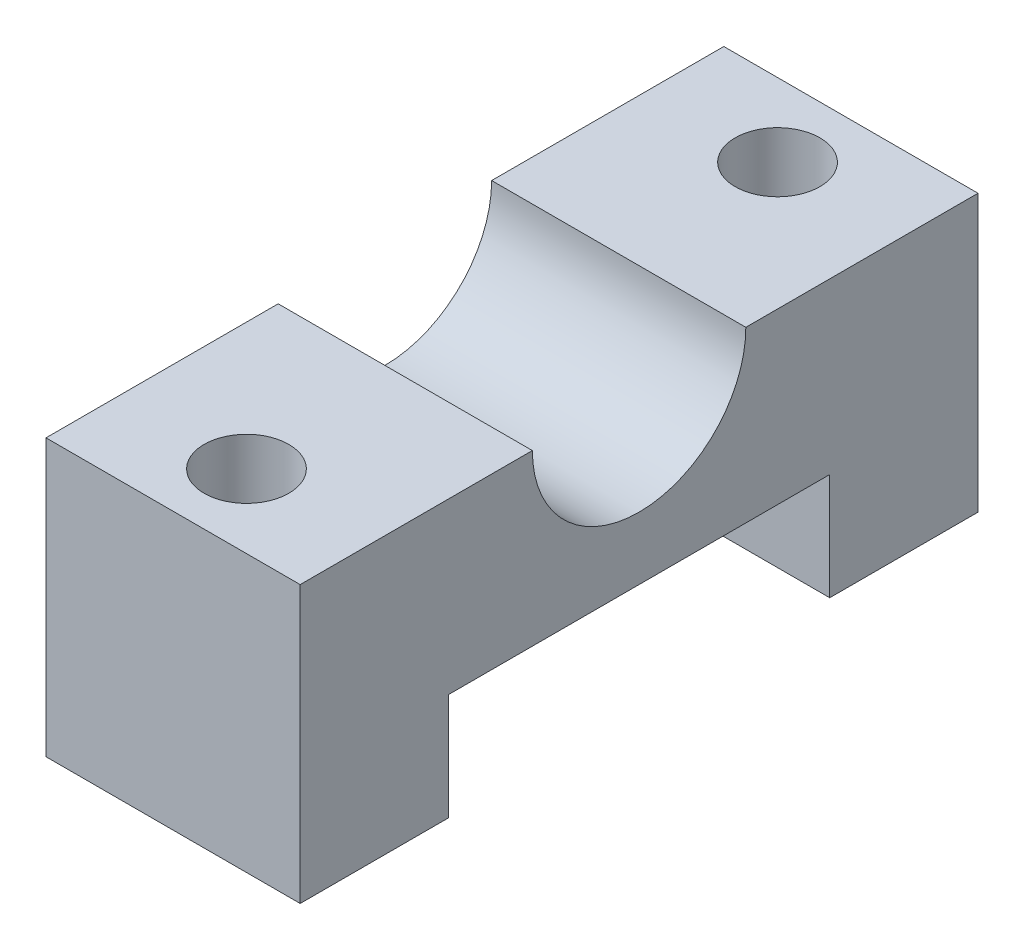
ISO-10303-21;
HEADER;
FILE_DESCRIPTION(('STEP AP214'),'2;1');
FILE_NAME('part.step','',(''),(''),'','','');
FILE_SCHEMA(('AUTOMOTIVE_DESIGN { 1 0 10303 214 1 1 1 1 }'));
ENDSEC;
DATA;
#1=APPLICATION_CONTEXT('core data for automotive mechanical design processes');
#2=APPLICATION_PROTOCOL_DEFINITION('international standard','automotive_design',2000,#1);
#3=PRODUCT_CONTEXT('',#1,'mechanical');
#4=PRODUCT('Part','Part','',(#3));
#5=PRODUCT_RELATED_PRODUCT_CATEGORY('part','',(#4));
#6=PRODUCT_DEFINITION_FORMATION('','',#4);
#7=PRODUCT_DEFINITION_CONTEXT('part definition',#1,'design');
#8=PRODUCT_DEFINITION('design','',#6,#7);
#9=PRODUCT_DEFINITION_SHAPE('','',#8);
#10=(LENGTH_UNIT() NAMED_UNIT(*) SI_UNIT(.MILLI.,.METRE.));
#11=(NAMED_UNIT(*) PLANE_ANGLE_UNIT() SI_UNIT($,.RADIAN.));
#12=(NAMED_UNIT(*) SI_UNIT($,.STERADIAN.) SOLID_ANGLE_UNIT());
#13=UNCERTAINTY_MEASURE_WITH_UNIT(LENGTH_MEASURE(1.E-05),#10,'distance_accuracy_value','');
#14=(GEOMETRIC_REPRESENTATION_CONTEXT(3) GLOBAL_UNCERTAINTY_ASSIGNED_CONTEXT((#13)) GLOBAL_UNIT_ASSIGNED_CONTEXT((#10,
#11,#12)) REPRESENTATION_CONTEXT('',''));
#15=CARTESIAN_POINT('',(0.,0.,0.));
#16=DIRECTION('',(0.,0.,1.));
#17=DIRECTION('',(1.,0.,0.));
#18=AXIS2_PLACEMENT_3D('',#15,#16,#17);
#19=CARTESIAN_POINT('',(9.525,-10.35,12.7));
#20=DIRECTION('',(0.,1.,0.));
#21=DIRECTION('',(0.,0.,1.));
#22=AXIS2_PLACEMENT_3D('',#19,#20,#21);
#23=PLANE('',#22);
#24=CARTESIAN_POINT('',(4.7625,-10.35,9.95));
#25=DIRECTION('',(0.,-1.,0.));
#26=DIRECTION('',(0.,0.,-1.));
#27=AXIS2_PLACEMENT_3D('',#24,#25,#26);
#28=CIRCLE('',#27,1.5875);
#29=CARTESIAN_POINT('',(4.7625,-10.35,8.3625));
#30=VERTEX_POINT('',#29);
#31=EDGE_CURVE('E229',#30,#30,#28,.T.);
#32=ORIENTED_EDGE('',*,*,#31,.F.);
#33=EDGE_LOOP('',(#32));
#34=FACE_BOUND('',#33,.T.);
#35=DIRECTION('',(0.,0.,-1.));
#36=VECTOR('',#35,1.);
#37=CARTESIAN_POINT('',(0.,-10.35,12.7));
#38=LINE('',#37,#36);
#39=CARTESIAN_POINT('',(0.,-10.35,12.7));
#40=VERTEX_POINT('',#39);
#41=CARTESIAN_POINT('',(0.,-10.35,7.14375));
#42=VERTEX_POINT('',#41);
#43=EDGE_CURVE('E137',#40,#42,#38,.T.);
#44=ORIENTED_EDGE('',*,*,#43,.T.);
#45=DIRECTION('',(1.,0.,0.));
#46=VECTOR('',#45,1.);
#47=CARTESIAN_POINT('',(0.,-10.35,7.14375));
#48=LINE('',#47,#46);
#49=CARTESIAN_POINT('',(9.525,-10.35,7.14375));
#50=VERTEX_POINT('',#49);
#51=EDGE_CURVE('E170',#42,#50,#48,.T.);
#52=ORIENTED_EDGE('',*,*,#51,.T.);
#53=DIRECTION('',(0.,0.,-1.));
#54=VECTOR('',#53,1.);
#55=CARTESIAN_POINT('',(9.525,-10.35,12.7));
#56=LINE('',#55,#54);
#57=CARTESIAN_POINT('',(9.525,-10.35,12.7));
#58=VERTEX_POINT('',#57);
#59=EDGE_CURVE('E92',#58,#50,#56,.T.);
#60=ORIENTED_EDGE('',*,*,#59,.F.);
#61=DIRECTION('',(-1.,0.,0.));
#62=VECTOR('',#61,1.);
#63=CARTESIAN_POINT('',(9.525,-10.35,12.7));
#64=LINE('',#63,#62);
#65=EDGE_CURVE('E11',#58,#40,#64,.T.);
#66=ORIENTED_EDGE('',*,*,#65,.T.);
#67=EDGE_LOOP('',(#44,#52,#60,#66));
#68=FACE_BOUND('',#67,.T.);
#69=ADVANCED_FACE('F33',(#34,#68),#23,.F.);
#70=CARTESIAN_POINT('',(9.525,0.,12.7));
#71=DIRECTION('',(0.,0.,-1.));
#72=DIRECTION('',(0.,1.,0.));
#73=AXIS2_PLACEMENT_3D('',#70,#71,#72);
#74=PLANE('',#73);
#75=DIRECTION('',(0.,-1.,0.));
#76=VECTOR('',#75,1.);
#77=CARTESIAN_POINT('',(0.,0.,12.7));
#78=LINE('',#77,#76);
#79=CARTESIAN_POINT('',(0.,0.,12.7));
#80=VERTEX_POINT('',#79);
#81=EDGE_CURVE('E132',#80,#40,#78,.T.);
#82=ORIENTED_EDGE('',*,*,#81,.T.);
#83=ORIENTED_EDGE('',*,*,#65,.F.);
#84=DIRECTION('',(0.,-1.,0.));
#85=VECTOR('',#84,1.);
#86=CARTESIAN_POINT('',(9.525,0.,12.7));
#87=LINE('',#86,#85);
#88=CARTESIAN_POINT('',(9.525,0.,12.7));
#89=VERTEX_POINT('',#88);
#90=EDGE_CURVE('E146',#89,#58,#87,.T.);
#91=ORIENTED_EDGE('',*,*,#90,.F.);
#92=DIRECTION('',(-1.,0.,0.));
#93=VECTOR('',#92,1.);
#94=CARTESIAN_POINT('',(9.525,0.,12.7));
#95=LINE('',#94,#93);
#96=EDGE_CURVE('E128',#89,#80,#95,.T.);
#97=ORIENTED_EDGE('',*,*,#96,.T.);
#98=EDGE_LOOP('',(#82,#83,#91,#97));
#99=FACE_BOUND('',#98,.T.);
#100=ADVANCED_FACE('F35',(#99),#74,.F.);
#101=CARTESIAN_POINT('',(4.7625,-10.35,-9.95));
#102=DIRECTION('',(0.,-1.,0.));
#103=DIRECTION('',(0.,0.,-1.));
#104=AXIS2_PLACEMENT_3D('',#101,#102,#103);
#105=CIRCLE('',#104,1.5875);
#106=CARTESIAN_POINT('',(4.7625,-10.35,-11.5375));
#107=VERTEX_POINT('',#106);
#108=EDGE_CURVE('E234',#107,#107,#105,.T.);
#109=ORIENTED_EDGE('',*,*,#108,.F.);
#110=EDGE_LOOP('',(#109));
#111=FACE_BOUND('',#110,.T.);
#112=CARTESIAN_POINT('',(9.525,-10.35,-7.14375));
#113=VERTEX_POINT('',#112);
#114=CARTESIAN_POINT('',(9.525,-10.35,-12.7));
#115=VERTEX_POINT('',#114);
#116=EDGE_CURVE('E166',#113,#115,#56,.T.);
#117=ORIENTED_EDGE('',*,*,#116,.F.);
#118=DIRECTION('',(1.,0.,0.));
#119=VECTOR('',#118,1.);
#120=CARTESIAN_POINT('',(0.,-10.35,-7.14375));
#121=LINE('',#120,#119);
#122=CARTESIAN_POINT('',(0.,-10.35,-7.14375));
#123=VERTEX_POINT('',#122);
#124=EDGE_CURVE('E204',#123,#113,#121,.T.);
#125=ORIENTED_EDGE('',*,*,#124,.F.);
#126=CARTESIAN_POINT('',(0.,-10.35,-12.7));
#127=VERTEX_POINT('',#126);
#128=EDGE_CURVE('E135',#123,#127,#38,.T.);
#129=ORIENTED_EDGE('',*,*,#128,.T.);
#130=DIRECTION('',(-1.,0.,0.));
#131=VECTOR('',#130,1.);
#132=CARTESIAN_POINT('',(9.525,-10.35,-12.7));
#133=LINE('',#132,#131);
#134=EDGE_CURVE('E41',#115,#127,#133,.T.);
#135=ORIENTED_EDGE('',*,*,#134,.F.);
#136=EDGE_LOOP('',(#117,#125,#129,#135));
#137=FACE_BOUND('',#136,.T.);
#138=ADVANCED_FACE('F214',(#111,#137),#23,.F.);
#139=CARTESIAN_POINT('',(9.525,0.,-12.7));
#140=DIRECTION('',(0.,0.,1.));
#141=DIRECTION('',(0.,-1.,0.));
#142=AXIS2_PLACEMENT_3D('',#139,#140,#141);
#143=PLANE('',#142);
#144=DIRECTION('',(0.,1.,0.));
#145=VECTOR('',#144,1.);
#146=CARTESIAN_POINT('',(0.,0.,-12.7));
#147=LINE('',#146,#145);
#148=CARTESIAN_POINT('',(0.,0.,-12.7));
#149=VERTEX_POINT('',#148);
#150=EDGE_CURVE('E140',#127,#149,#147,.T.);
#151=ORIENTED_EDGE('',*,*,#150,.T.);
#152=DIRECTION('',(-1.,0.,0.));
#153=VECTOR('',#152,1.);
#154=CARTESIAN_POINT('',(9.525,0.,-12.7));
#155=LINE('',#154,#153);
#156=CARTESIAN_POINT('',(9.525,0.,-12.7));
#157=VERTEX_POINT('',#156);
#158=EDGE_CURVE('E123',#157,#149,#155,.T.);
#159=ORIENTED_EDGE('',*,*,#158,.F.);
#160=DIRECTION('',(0.,1.,0.));
#161=VECTOR('',#160,1.);
#162=CARTESIAN_POINT('',(9.525,0.,-12.7));
#163=LINE('',#162,#161);
#164=EDGE_CURVE('E111',#115,#157,#163,.T.);
#165=ORIENTED_EDGE('',*,*,#164,.F.);
#166=ORIENTED_EDGE('',*,*,#134,.T.);
#167=EDGE_LOOP('',(#151,#159,#165,#166));
#168=FACE_BOUND('',#167,.T.);
#169=ADVANCED_FACE('F153',(#168),#143,.F.);
#170=CARTESIAN_POINT('',(9.525,0.,-4.));
#171=DIRECTION('',(0.,-1.,0.));
#172=DIRECTION('',(0.,0.,-1.));
#173=AXIS2_PLACEMENT_3D('',#170,#171,#172);
#174=PLANE('',#173);
#175=CARTESIAN_POINT('',(4.7625,0.,-9.95));
#176=DIRECTION('',(0.,-1.,0.));
#177=DIRECTION('',(0.,0.,-1.));
#178=AXIS2_PLACEMENT_3D('',#175,#176,#177);
#179=CIRCLE('',#178,1.5875);
#180=CARTESIAN_POINT('',(4.7625,0.,-11.5375));
#181=VERTEX_POINT('',#180);
#182=EDGE_CURVE('E209',#181,#181,#179,.T.);
#183=ORIENTED_EDGE('',*,*,#182,.T.);
#184=EDGE_LOOP('',(#183));
#185=FACE_BOUND('',#184,.T.);
#186=DIRECTION('',(0.,0.,1.));
#187=VECTOR('',#186,1.);
#188=CARTESIAN_POINT('',(0.,0.,-4.));
#189=LINE('',#188,#187);
#190=CARTESIAN_POINT('',(0.,0.,-4.));
#191=VERTEX_POINT('',#190);
#192=EDGE_CURVE('E120',#149,#191,#189,.T.);
#193=ORIENTED_EDGE('',*,*,#192,.T.);
#194=DIRECTION('',(-1.,0.,0.));
#195=VECTOR('',#194,1.);
#196=CARTESIAN_POINT('',(9.525,0.,-4.));
#197=LINE('',#196,#195);
#198=CARTESIAN_POINT('',(9.525,0.,-4.));
#199=VERTEX_POINT('',#198);
#200=EDGE_CURVE('E117',#199,#191,#197,.T.);
#201=ORIENTED_EDGE('',*,*,#200,.F.);
#202=DIRECTION('',(0.,0.,1.));
#203=VECTOR('',#202,1.);
#204=CARTESIAN_POINT('',(9.525,0.,-4.));
#205=LINE('',#204,#203);
#206=EDGE_CURVE('E103',#157,#199,#205,.T.);
#207=ORIENTED_EDGE('',*,*,#206,.F.);
#208=ORIENTED_EDGE('',*,*,#158,.T.);
#209=EDGE_LOOP('',(#193,#201,#207,#208));
#210=FACE_BOUND('',#209,.T.);
#211=ADVANCED_FACE('F118',(#185,#210),#174,.F.);
#212=CARTESIAN_POINT('',(9.525,0.,0.));
#213=DIRECTION('',(-1.,0.,0.));
#214=DIRECTION('',(0.,0.,1.));
#215=AXIS2_PLACEMENT_3D('',#212,#213,#214);
#216=CYLINDRICAL_SURFACE('',#215,4.);
#217=CARTESIAN_POINT('',(0.,0.,0.));
#218=DIRECTION('',(-1.,0.,0.));
#219=DIRECTION('',(0.,0.,-1.));
#220=AXIS2_PLACEMENT_3D('',#217,#218,#219);
#221=CIRCLE('',#220,4.);
#222=CARTESIAN_POINT('',(0.,0.,4.));
#223=VERTEX_POINT('',#222);
#224=EDGE_CURVE('E143',#191,#223,#221,.T.);
#225=ORIENTED_EDGE('',*,*,#224,.T.);
#226=DIRECTION('',(-1.,0.,0.));
#227=VECTOR('',#226,1.);
#228=CARTESIAN_POINT('',(9.525,0.,4.));
#229=LINE('',#228,#227);
#230=CARTESIAN_POINT('',(9.525,0.,4.));
#231=VERTEX_POINT('',#230);
#232=EDGE_CURVE('E124',#231,#223,#229,.T.);
#233=ORIENTED_EDGE('',*,*,#232,.F.);
#234=CARTESIAN_POINT('',(9.525,0.,0.));
#235=DIRECTION('',(-1.,0.,0.));
#236=DIRECTION('',(0.,0.,-1.));
#237=AXIS2_PLACEMENT_3D('',#234,#235,#236);
#238=CIRCLE('',#237,4.);
#239=EDGE_CURVE('E108',#199,#231,#238,.T.);
#240=ORIENTED_EDGE('',*,*,#239,.F.);
#241=ORIENTED_EDGE('',*,*,#200,.T.);
#242=EDGE_LOOP('',(#225,#233,#240,#241));
#243=FACE_BOUND('',#242,.T.);
#244=ADVANCED_FACE('F126',(#243),#216,.F.);
#245=CARTESIAN_POINT('',(9.525,0.,12.7));
#246=DIRECTION('',(0.,-1.,0.));
#247=DIRECTION('',(0.,0.,-1.));
#248=AXIS2_PLACEMENT_3D('',#245,#246,#247);
#249=PLANE('',#248);
#250=CARTESIAN_POINT('',(4.7625,0.,9.95));
#251=DIRECTION('',(0.,-1.,0.));
#252=DIRECTION('',(0.,0.,-1.));
#253=AXIS2_PLACEMENT_3D('',#250,#251,#252);
#254=CIRCLE('',#253,1.5875);
#255=CARTESIAN_POINT('',(4.7625,0.,8.3625));
#256=VERTEX_POINT('',#255);
#257=EDGE_CURVE('E231',#256,#256,#254,.T.);
#258=ORIENTED_EDGE('',*,*,#257,.T.);
#259=EDGE_LOOP('',(#258));
#260=FACE_BOUND('',#259,.T.);
#261=DIRECTION('',(0.,0.,1.));
#262=VECTOR('',#261,1.);
#263=CARTESIAN_POINT('',(0.,0.,12.7));
#264=LINE('',#263,#262);
#265=EDGE_CURVE('E84',#223,#80,#264,.T.);
#266=ORIENTED_EDGE('',*,*,#265,.T.);
#267=ORIENTED_EDGE('',*,*,#96,.F.);
#268=DIRECTION('',(0.,0.,1.));
#269=VECTOR('',#268,1.);
#270=CARTESIAN_POINT('',(9.525,0.,12.7));
#271=LINE('',#270,#269);
#272=EDGE_CURVE('E57',#231,#89,#271,.T.);
#273=ORIENTED_EDGE('',*,*,#272,.F.);
#274=ORIENTED_EDGE('',*,*,#232,.T.);
#275=EDGE_LOOP('',(#266,#267,#273,#274));
#276=FACE_BOUND('',#275,.T.);
#277=ADVANCED_FACE('F162',(#260,#276),#249,.F.);
#278=CARTESIAN_POINT('',(9.525,0.,0.));
#279=DIRECTION('',(1.,0.,0.));
#280=DIRECTION('',(0.,0.,-1.));
#281=AXIS2_PLACEMENT_3D('',#278,#279,#280);
#282=PLANE('',#281);
#283=DIRECTION('',(0.,-1.,0.));
#284=VECTOR('',#283,1.);
#285=CARTESIAN_POINT('',(9.525,-6.35,7.14375));
#286=LINE('',#285,#284);
#287=CARTESIAN_POINT('',(9.525,-6.35,7.14375));
#288=VERTEX_POINT('',#287);
#289=EDGE_CURVE('E175',#288,#50,#286,.T.);
#290=ORIENTED_EDGE('',*,*,#289,.F.);
#291=DIRECTION('',(0.,0.,1.));
#292=VECTOR('',#291,1.);
#293=CARTESIAN_POINT('',(9.525,-6.35,7.14375));
#294=LINE('',#293,#292);
#295=CARTESIAN_POINT('',(9.525,-6.35,-7.14375));
#296=VERTEX_POINT('',#295);
#297=EDGE_CURVE('E198',#296,#288,#294,.T.);
#298=ORIENTED_EDGE('',*,*,#297,.F.);
#299=DIRECTION('',(0.,1.,0.));
#300=VECTOR('',#299,1.);
#301=CARTESIAN_POINT('',(9.525,-6.35,-7.14375));
#302=LINE('',#301,#300);
#303=EDGE_CURVE('E208',#113,#296,#302,.T.);
#304=ORIENTED_EDGE('',*,*,#303,.F.);
#305=ORIENTED_EDGE('',*,*,#116,.T.);
#306=ORIENTED_EDGE('',*,*,#164,.T.);
#307=ORIENTED_EDGE('',*,*,#206,.T.);
#308=ORIENTED_EDGE('',*,*,#239,.T.);
#309=ORIENTED_EDGE('',*,*,#272,.T.);
#310=ORIENTED_EDGE('',*,*,#90,.T.);
#311=ORIENTED_EDGE('',*,*,#59,.T.);
#312=EDGE_LOOP('',(#290,#298,#304,#305,#306,#307,#308,#309,#310,#311));
#313=FACE_BOUND('',#312,.T.);
#314=ADVANCED_FACE('F106',(#313),#282,.T.);
#315=CARTESIAN_POINT('',(0.,0.,0.));
#316=DIRECTION('',(1.,0.,0.));
#317=DIRECTION('',(0.,0.,-1.));
#318=AXIS2_PLACEMENT_3D('',#315,#316,#317);
#319=PLANE('',#318);
#320=DIRECTION('',(0.,0.,1.));
#321=VECTOR('',#320,1.);
#322=CARTESIAN_POINT('',(0.,-6.35,7.14375));
#323=LINE('',#322,#321);
#324=CARTESIAN_POINT('',(0.,-6.35,-7.14375));
#325=VERTEX_POINT('',#324);
#326=CARTESIAN_POINT('',(0.,-6.35,7.14375));
#327=VERTEX_POINT('',#326);
#328=EDGE_CURVE('E48',#325,#327,#323,.T.);
#329=ORIENTED_EDGE('',*,*,#328,.T.);
#330=DIRECTION('',(0.,-1.,0.));
#331=VECTOR('',#330,1.);
#332=CARTESIAN_POINT('',(0.,-6.35,7.14375));
#333=LINE('',#332,#331);
#334=EDGE_CURVE('E200',#327,#42,#333,.T.);
#335=ORIENTED_EDGE('',*,*,#334,.T.);
#336=ORIENTED_EDGE('',*,*,#43,.F.);
#337=ORIENTED_EDGE('',*,*,#81,.F.);
#338=ORIENTED_EDGE('',*,*,#265,.F.);
#339=ORIENTED_EDGE('',*,*,#224,.F.);
#340=ORIENTED_EDGE('',*,*,#192,.F.);
#341=ORIENTED_EDGE('',*,*,#150,.F.);
#342=ORIENTED_EDGE('',*,*,#128,.F.);
#343=DIRECTION('',(0.,1.,0.));
#344=VECTOR('',#343,1.);
#345=CARTESIAN_POINT('',(0.,-6.35,-7.14375));
#346=LINE('',#345,#344);
#347=EDGE_CURVE('E195',#123,#325,#346,.T.);
#348=ORIENTED_EDGE('',*,*,#347,.T.);
#349=EDGE_LOOP('',(#329,#335,#336,#337,#338,#339,#340,#341,#342,#348));
#350=FACE_BOUND('',#349,.T.);
#351=ADVANCED_FACE('F158',(#350),#319,.F.);
#352=CARTESIAN_POINT('',(0.,-6.35,7.14375));
#353=DIRECTION('',(0.,0.,1.));
#354=DIRECTION('',(0.,-1.,0.));
#355=AXIS2_PLACEMENT_3D('',#352,#353,#354);
#356=PLANE('',#355);
#357=ORIENTED_EDGE('',*,*,#289,.T.);
#358=ORIENTED_EDGE('',*,*,#51,.F.);
#359=ORIENTED_EDGE('',*,*,#334,.F.);
#360=DIRECTION('',(1.,0.,0.));
#361=VECTOR('',#360,1.);
#362=CARTESIAN_POINT('',(0.,-6.35,7.14375));
#363=LINE('',#362,#361);
#364=EDGE_CURVE('E136',#327,#288,#363,.T.);
#365=ORIENTED_EDGE('',*,*,#364,.T.);
#366=EDGE_LOOP('',(#357,#358,#359,#365));
#367=FACE_BOUND('',#366,.T.);
#368=ADVANCED_FACE('F201',(#367),#356,.F.);
#369=CARTESIAN_POINT('',(0.,-6.35,7.14375));
#370=DIRECTION('',(0.,1.,0.));
#371=DIRECTION('',(0.,0.,1.));
#372=AXIS2_PLACEMENT_3D('',#369,#370,#371);
#373=PLANE('',#372);
#374=ORIENTED_EDGE('',*,*,#297,.T.);
#375=ORIENTED_EDGE('',*,*,#364,.F.);
#376=ORIENTED_EDGE('',*,*,#328,.F.);
#377=DIRECTION('',(1.,0.,0.));
#378=VECTOR('',#377,1.);
#379=CARTESIAN_POINT('',(0.,-6.35,-7.14375));
#380=LINE('',#379,#378);
#381=EDGE_CURVE('E187',#325,#296,#380,.T.);
#382=ORIENTED_EDGE('',*,*,#381,.T.);
#383=EDGE_LOOP('',(#374,#375,#376,#382));
#384=FACE_BOUND('',#383,.T.);
#385=ADVANCED_FACE('F197',(#384),#373,.F.);
#386=CARTESIAN_POINT('',(0.,-6.35,-7.14375));
#387=DIRECTION('',(0.,0.,-1.));
#388=DIRECTION('',(0.,1.,0.));
#389=AXIS2_PLACEMENT_3D('',#386,#387,#388);
#390=PLANE('',#389);
#391=ORIENTED_EDGE('',*,*,#303,.T.);
#392=ORIENTED_EDGE('',*,*,#381,.F.);
#393=ORIENTED_EDGE('',*,*,#347,.F.);
#394=ORIENTED_EDGE('',*,*,#124,.T.);
#395=EDGE_LOOP('',(#391,#392,#393,#394));
#396=FACE_BOUND('',#395,.T.);
#397=ADVANCED_FACE('F213',(#396),#390,.F.);
#398=CARTESIAN_POINT('',(4.7625,0.,-9.95));
#399=DIRECTION('',(0.,-1.,0.));
#400=DIRECTION('',(0.,0.,-1.));
#401=AXIS2_PLACEMENT_3D('',#398,#399,#400);
#402=CYLINDRICAL_SURFACE('',#401,1.5875);
#403=ORIENTED_EDGE('',*,*,#182,.F.);
#404=EDGE_LOOP('',(#403));
#405=FACE_BOUND('',#404,.T.);
#406=ORIENTED_EDGE('',*,*,#108,.T.);
#407=EDGE_LOOP('',(#406));
#408=FACE_BOUND('',#407,.T.);
#409=ADVANCED_FACE('F241',(#405,#408),#402,.F.);
#410=CARTESIAN_POINT('',(4.7625,0.,9.95));
#411=DIRECTION('',(0.,-1.,0.));
#412=DIRECTION('',(0.,0.,-1.));
#413=AXIS2_PLACEMENT_3D('',#410,#411,#412);
#414=CYLINDRICAL_SURFACE('',#413,1.5875);
#415=ORIENTED_EDGE('',*,*,#257,.F.);
#416=EDGE_LOOP('',(#415));
#417=FACE_BOUND('',#416,.T.);
#418=ORIENTED_EDGE('',*,*,#31,.T.);
#419=EDGE_LOOP('',(#418));
#420=FACE_BOUND('',#419,.T.);
#421=ADVANCED_FACE('F243',(#417,#420),#414,.F.);
#422=CLOSED_SHELL('',(#69,#100,#138,#169,#211,#244,#277,#314,#351,#368,#385,#397,#409,#421));
#423=MANIFOLD_SOLID_BREP('B2',#422);
#424=ADVANCED_BREP_SHAPE_REPRESENTATION('',(#18,#423),#14);
#425=SHAPE_DEFINITION_REPRESENTATION(#9,#424);
ENDSEC;
END-ISO-10303-21;
